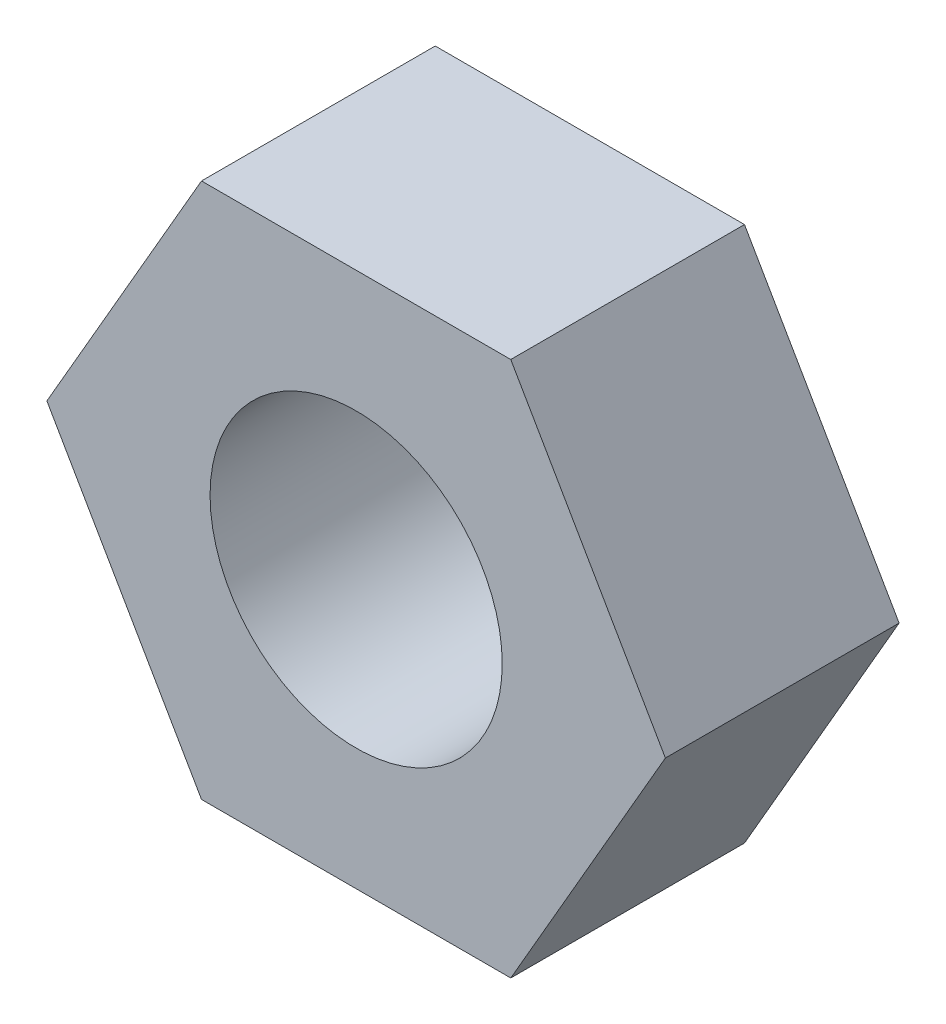
ISO-10303-21;
HEADER;
FILE_DESCRIPTION(('STEP AP214'),'2;1');
FILE_NAME('part.step','',(''),(''),'','','');
FILE_SCHEMA(('AUTOMOTIVE_DESIGN { 1 0 10303 214 1 1 1 1 }'));
ENDSEC;
DATA;
#1=APPLICATION_CONTEXT('core data for automotive mechanical design processes');
#2=APPLICATION_PROTOCOL_DEFINITION('international standard','automotive_design',2000,#1);
#3=PRODUCT_CONTEXT('',#1,'mechanical');
#4=PRODUCT('Part','Part','',(#3));
#5=PRODUCT_RELATED_PRODUCT_CATEGORY('part','',(#4));
#6=PRODUCT_DEFINITION_FORMATION('','',#4);
#7=PRODUCT_DEFINITION_CONTEXT('part definition',#1,'design');
#8=PRODUCT_DEFINITION('design','',#6,#7);
#9=PRODUCT_DEFINITION_SHAPE('','',#8);
#10=(LENGTH_UNIT() NAMED_UNIT(*) SI_UNIT(.MILLI.,.METRE.));
#11=(NAMED_UNIT(*) PLANE_ANGLE_UNIT() SI_UNIT($,.RADIAN.));
#12=(NAMED_UNIT(*) SI_UNIT($,.STERADIAN.) SOLID_ANGLE_UNIT());
#13=UNCERTAINTY_MEASURE_WITH_UNIT(LENGTH_MEASURE(1.E-05),#10,'distance_accuracy_value','');
#14=(GEOMETRIC_REPRESENTATION_CONTEXT(3) GLOBAL_UNCERTAINTY_ASSIGNED_CONTEXT((#13)) GLOBAL_UNIT_ASSIGNED_CONTEXT((#10,
#11,#12)) REPRESENTATION_CONTEXT('',''));
#15=CARTESIAN_POINT('',(0.,0.,0.));
#16=DIRECTION('',(0.,0.,1.));
#17=DIRECTION('',(1.,0.,0.));
#18=AXIS2_PLACEMENT_3D('',#15,#16,#17);
#19=CARTESIAN_POINT('',(0.,0.,1.2));
#20=DIRECTION('',(0.,0.,1.));
#21=DIRECTION('',(1.,0.,0.));
#22=AXIS2_PLACEMENT_3D('',#19,#20,#21);
#23=PLANE('',#22);
#24=CARTESIAN_POINT('',(0.,0.,1.2));
#25=DIRECTION('',(0.,0.,1.));
#26=DIRECTION('',(1.,0.,0.));
#27=AXIS2_PLACEMENT_3D('',#24,#25,#26);
#28=CIRCLE('',#27,1.5);
#29=CARTESIAN_POINT('',(1.5,0.,1.2));
#30=VERTEX_POINT('',#29);
#31=EDGE_CURVE('E24',#30,#30,#28,.T.);
#32=ORIENTED_EDGE('',*,*,#31,.F.);
#33=EDGE_LOOP('',(#32));
#34=FACE_BOUND('',#33,.T.);
#35=DIRECTION('',(-0.50000000000019,0.866025403784329,0.));
#36=VECTOR('',#35,1.);
#37=CARTESIAN_POINT('',(3.175519630485,0.,1.2));
#38=LINE('',#37,#36);
#39=CARTESIAN_POINT('',(3.175519630485,0.,1.2));
#40=VERTEX_POINT('',#39);
#41=CARTESIAN_POINT('',(1.587759815242,2.750080670216,1.2));
#42=VERTEX_POINT('',#41);
#43=EDGE_CURVE('E252',#40,#42,#38,.T.);
#44=ORIENTED_EDGE('',*,*,#43,.T.);
#45=DIRECTION('',(-1.,0.,0.));
#46=VECTOR('',#45,1.);
#47=CARTESIAN_POINT('',(1.587759815242,2.750080670216,1.2));
#48=LINE('',#47,#46);
#49=CARTESIAN_POINT('',(-1.587759815242,2.750080670216,1.2));
#50=VERTEX_POINT('',#49);
#51=EDGE_CURVE('E96',#42,#50,#48,.T.);
#52=ORIENTED_EDGE('',*,*,#51,.T.);
#53=DIRECTION('',(-0.50000000000019,-0.866025403784329,0.));
#54=VECTOR('',#53,1.);
#55=CARTESIAN_POINT('',(-1.587759815242,2.750080670216,1.2));
#56=LINE('',#55,#54);
#57=CARTESIAN_POINT('',(-3.175519630485,0.,1.2));
#58=VERTEX_POINT('',#57);
#59=EDGE_CURVE('E110',#50,#58,#56,.T.);
#60=ORIENTED_EDGE('',*,*,#59,.T.);
#61=DIRECTION('',(0.50000000000019,-0.866025403784329,0.));
#62=VECTOR('',#61,1.);
#63=CARTESIAN_POINT('',(-3.175519630485,0.,1.2));
#64=LINE('',#63,#62);
#65=CARTESIAN_POINT('',(-1.587759815242,-2.750080670216,1.2));
#66=VERTEX_POINT('',#65);
#67=EDGE_CURVE('E73',#58,#66,#64,.T.);
#68=ORIENTED_EDGE('',*,*,#67,.T.);
#69=DIRECTION('',(1.,0.,0.));
#70=VECTOR('',#69,1.);
#71=CARTESIAN_POINT('',(-1.587759815242,-2.750080670216,1.2));
#72=LINE('',#71,#70);
#73=CARTESIAN_POINT('',(1.587759815242,-2.750080670216,1.2));
#74=VERTEX_POINT('',#73);
#75=EDGE_CURVE('E70',#66,#74,#72,.T.);
#76=ORIENTED_EDGE('',*,*,#75,.T.);
#77=DIRECTION('',(0.50000000000019,0.866025403784329,0.));
#78=VECTOR('',#77,1.);
#79=CARTESIAN_POINT('',(1.587759815242,-2.750080670216,1.2));
#80=LINE('',#79,#78);
#81=EDGE_CURVE('E51',#74,#40,#80,.T.);
#82=ORIENTED_EDGE('',*,*,#81,.T.);
#83=EDGE_LOOP('',(#44,#52,#60,#68,#76,#82));
#84=FACE_BOUND('',#83,.T.);
#85=ADVANCED_FACE('F15',(#34,#84),#23,.T.);
#86=CARTESIAN_POINT('',(0.,0.,-1.2));
#87=DIRECTION('',(0.,0.,1.));
#88=DIRECTION('',(1.,0.,0.));
#89=AXIS2_PLACEMENT_3D('',#86,#87,#88);
#90=PLANE('',#89);
#91=CARTESIAN_POINT('',(0.,0.,-1.2));
#92=DIRECTION('',(0.,0.,1.));
#93=DIRECTION('',(1.,0.,0.));
#94=AXIS2_PLACEMENT_3D('',#91,#92,#93);
#95=CIRCLE('',#94,1.5);
#96=CARTESIAN_POINT('',(1.5,0.,-1.2));
#97=VERTEX_POINT('',#96);
#98=EDGE_CURVE('E10',#97,#97,#95,.T.);
#99=ORIENTED_EDGE('',*,*,#98,.T.);
#100=EDGE_LOOP('',(#99));
#101=FACE_BOUND('',#100,.T.);
#102=DIRECTION('',(0.50000000000019,0.866025403784329,0.));
#103=VECTOR('',#102,1.);
#104=CARTESIAN_POINT('',(1.587759815242,-2.750080670216,-1.2));
#105=LINE('',#104,#103);
#106=CARTESIAN_POINT('',(1.587759815242,-2.750080670216,-1.2));
#107=VERTEX_POINT('',#106);
#108=CARTESIAN_POINT('',(3.175519630485,0.,-1.2));
#109=VERTEX_POINT('',#108);
#110=EDGE_CURVE('E66',#107,#109,#105,.T.);
#111=ORIENTED_EDGE('',*,*,#110,.F.);
#112=DIRECTION('',(1.,0.,0.));
#113=VECTOR('',#112,1.);
#114=CARTESIAN_POINT('',(-1.587759815242,-2.750080670216,-1.2));
#115=LINE('',#114,#113);
#116=CARTESIAN_POINT('',(-1.587759815242,-2.750080670216,-1.2));
#117=VERTEX_POINT('',#116);
#118=EDGE_CURVE('E81',#117,#107,#115,.T.);
#119=ORIENTED_EDGE('',*,*,#118,.F.);
#120=DIRECTION('',(0.50000000000019,-0.866025403784329,0.));
#121=VECTOR('',#120,1.);
#122=CARTESIAN_POINT('',(-3.175519630485,0.,-1.2));
#123=LINE('',#122,#121);
#124=CARTESIAN_POINT('',(-3.175519630485,0.,-1.2));
#125=VERTEX_POINT('',#124);
#126=EDGE_CURVE('E112',#125,#117,#123,.T.);
#127=ORIENTED_EDGE('',*,*,#126,.F.);
#128=DIRECTION('',(-0.50000000000019,-0.866025403784329,0.));
#129=VECTOR('',#128,1.);
#130=CARTESIAN_POINT('',(-1.587759815242,2.750080670216,-1.2));
#131=LINE('',#130,#129);
#132=CARTESIAN_POINT('',(-1.587759815242,2.750080670216,-1.2));
#133=VERTEX_POINT('',#132);
#134=EDGE_CURVE('E100',#133,#125,#131,.T.);
#135=ORIENTED_EDGE('',*,*,#134,.F.);
#136=DIRECTION('',(-1.,0.,0.));
#137=VECTOR('',#136,1.);
#138=CARTESIAN_POINT('',(1.587759815242,2.750080670216,-1.2));
#139=LINE('',#138,#137);
#140=CARTESIAN_POINT('',(1.587759815242,2.750080670216,-1.2));
#141=VERTEX_POINT('',#140);
#142=EDGE_CURVE('E89',#141,#133,#139,.T.);
#143=ORIENTED_EDGE('',*,*,#142,.F.);
#144=DIRECTION('',(-0.50000000000019,0.866025403784329,0.));
#145=VECTOR('',#144,1.);
#146=CARTESIAN_POINT('',(3.175519630485,0.,-1.2));
#147=LINE('',#146,#145);
#148=EDGE_CURVE('E248',#109,#141,#147,.T.);
#149=ORIENTED_EDGE('',*,*,#148,.F.);
#150=EDGE_LOOP('',(#111,#119,#127,#135,#143,#149));
#151=FACE_BOUND('',#150,.T.);
#152=ADVANCED_FACE('F149',(#101,#151),#90,.F.);
#153=CARTESIAN_POINT('',(0.,0.,-1.2));
#154=DIRECTION('',(0.,0.,-1.));
#155=DIRECTION('',(1.,0.,0.));
#156=AXIS2_PLACEMENT_3D('',#153,#154,#155);
#157=CYLINDRICAL_SURFACE('',#156,1.5);
#158=DIRECTION('',(0.,0.,1.));
#159=VECTOR('',#158,1.);
#160=CARTESIAN_POINT('',(1.5,0.,-1.2));
#161=LINE('',#160,#159);
#162=EDGE_CURVE('E65',#97,#30,#161,.T.);
#163=ORIENTED_EDGE('',*,*,#162,.T.);
#164=ORIENTED_EDGE('',*,*,#31,.T.);
#165=ORIENTED_EDGE('',*,*,#162,.F.);
#166=ORIENTED_EDGE('',*,*,#98,.F.);
#167=EDGE_LOOP('',(#163,#164,#165,#166));
#168=FACE_BOUND('',#167,.T.);
#169=ADVANCED_FACE('F154',(#168),#157,.F.);
#170=CARTESIAN_POINT('',(1.587759815242,-2.750080670216,-1.2));
#171=DIRECTION('',(-0.866025403784329,0.50000000000019,0.));
#172=DIRECTION('',(0.,0.,1.));
#173=AXIS2_PLACEMENT_3D('',#170,#171,#172);
#174=PLANE('',#173);
#175=ORIENTED_EDGE('',*,*,#110,.T.);
#176=DIRECTION('',(0.,0.,1.));
#177=VECTOR('',#176,1.);
#178=CARTESIAN_POINT('',(3.175519630485,0.,-1.2));
#179=LINE('',#178,#177);
#180=EDGE_CURVE('E60',#109,#40,#179,.T.);
#181=ORIENTED_EDGE('',*,*,#180,.T.);
#182=ORIENTED_EDGE('',*,*,#81,.F.);
#183=DIRECTION('',(0.,0.,1.));
#184=VECTOR('',#183,1.);
#185=CARTESIAN_POINT('',(1.587759815242,-2.750080670216,-1.2));
#186=LINE('',#185,#184);
#187=EDGE_CURVE('E56',#107,#74,#186,.T.);
#188=ORIENTED_EDGE('',*,*,#187,.F.);
#189=EDGE_LOOP('',(#175,#181,#182,#188));
#190=FACE_BOUND('',#189,.T.);
#191=ADVANCED_FACE('F54',(#190),#174,.F.);
#192=CARTESIAN_POINT('',(-1.587759815242,-2.750080670216,-1.2));
#193=DIRECTION('',(0.,1.,0.));
#194=DIRECTION('',(1.,0.,0.));
#195=AXIS2_PLACEMENT_3D('',#192,#193,#194);
#196=PLANE('',#195);
#197=ORIENTED_EDGE('',*,*,#118,.T.);
#198=ORIENTED_EDGE('',*,*,#187,.T.);
#199=ORIENTED_EDGE('',*,*,#75,.F.);
#200=DIRECTION('',(0.,0.,1.));
#201=VECTOR('',#200,1.);
#202=CARTESIAN_POINT('',(-1.587759815242,-2.750080670216,-1.2));
#203=LINE('',#202,#201);
#204=EDGE_CURVE('E107',#117,#66,#203,.T.);
#205=ORIENTED_EDGE('',*,*,#204,.F.);
#206=EDGE_LOOP('',(#197,#198,#199,#205));
#207=FACE_BOUND('',#206,.T.);
#208=ADVANCED_FACE('F79',(#207),#196,.F.);
#209=CARTESIAN_POINT('',(-3.175519630485,0.,-1.2));
#210=DIRECTION('',(0.866025403784329,0.50000000000019,0.));
#211=DIRECTION('',(0.,0.,-1.));
#212=AXIS2_PLACEMENT_3D('',#209,#210,#211);
#213=PLANE('',#212);
#214=ORIENTED_EDGE('',*,*,#126,.T.);
#215=ORIENTED_EDGE('',*,*,#204,.T.);
#216=ORIENTED_EDGE('',*,*,#67,.F.);
#217=DIRECTION('',(0.,0.,1.));
#218=VECTOR('',#217,1.);
#219=CARTESIAN_POINT('',(-3.175519630485,0.,-1.2));
#220=LINE('',#219,#218);
#221=EDGE_CURVE('E104',#125,#58,#220,.T.);
#222=ORIENTED_EDGE('',*,*,#221,.F.);
#223=EDGE_LOOP('',(#214,#215,#216,#222));
#224=FACE_BOUND('',#223,.T.);
#225=ADVANCED_FACE('F164',(#224),#213,.F.);
#226=CARTESIAN_POINT('',(-1.587759815242,2.750080670216,-1.2));
#227=DIRECTION('',(0.866025403784329,-0.50000000000019,0.));
#228=DIRECTION('',(0.,0.,-1.));
#229=AXIS2_PLACEMENT_3D('',#226,#227,#228);
#230=PLANE('',#229);
#231=ORIENTED_EDGE('',*,*,#134,.T.);
#232=ORIENTED_EDGE('',*,*,#221,.T.);
#233=ORIENTED_EDGE('',*,*,#59,.F.);
#234=DIRECTION('',(0.,0.,1.));
#235=VECTOR('',#234,1.);
#236=CARTESIAN_POINT('',(-1.587759815242,2.750080670216,-1.2));
#237=LINE('',#236,#235);
#238=EDGE_CURVE('E92',#133,#50,#237,.T.);
#239=ORIENTED_EDGE('',*,*,#238,.F.);
#240=EDGE_LOOP('',(#231,#232,#233,#239));
#241=FACE_BOUND('',#240,.T.);
#242=ADVANCED_FACE('F143',(#241),#230,.F.);
#243=CARTESIAN_POINT('',(1.587759815242,2.750080670216,-1.2));
#244=DIRECTION('',(0.,-1.,0.));
#245=DIRECTION('',(0.,0.,-1.));
#246=AXIS2_PLACEMENT_3D('',#243,#244,#245);
#247=PLANE('',#246);
#248=ORIENTED_EDGE('',*,*,#142,.T.);
#249=ORIENTED_EDGE('',*,*,#238,.T.);
#250=ORIENTED_EDGE('',*,*,#51,.F.);
#251=DIRECTION('',(0.,0.,1.));
#252=VECTOR('',#251,1.);
#253=CARTESIAN_POINT('',(1.587759815242,2.750080670216,-1.2));
#254=LINE('',#253,#252);
#255=EDGE_CURVE('E250',#141,#42,#254,.T.);
#256=ORIENTED_EDGE('',*,*,#255,.F.);
#257=EDGE_LOOP('',(#248,#249,#250,#256));
#258=FACE_BOUND('',#257,.T.);
#259=ADVANCED_FACE('F133',(#258),#247,.F.);
#260=CARTESIAN_POINT('',(3.175519630485,0.,-1.2));
#261=DIRECTION('',(-0.866025403784329,-0.50000000000019,0.));
#262=DIRECTION('',(-0.50000000000019,0.866025403784329,0.));
#263=AXIS2_PLACEMENT_3D('',#260,#261,#262);
#264=PLANE('',#263);
#265=ORIENTED_EDGE('',*,*,#148,.T.);
#266=ORIENTED_EDGE('',*,*,#255,.T.);
#267=ORIENTED_EDGE('',*,*,#43,.F.);
#268=ORIENTED_EDGE('',*,*,#180,.F.);
#269=EDGE_LOOP('',(#265,#266,#267,#268));
#270=FACE_BOUND('',#269,.T.);
#271=ADVANCED_FACE('F128',(#270),#264,.F.);
#272=CLOSED_SHELL('',(#85,#152,#169,#191,#208,#225,#242,#259,#271));
#273=MANIFOLD_SOLID_BREP('B1',#272);
#274=ADVANCED_BREP_SHAPE_REPRESENTATION('',(#18,#273),#14);
#275=SHAPE_DEFINITION_REPRESENTATION(#9,#274);
ENDSEC;
END-ISO-10303-21;
